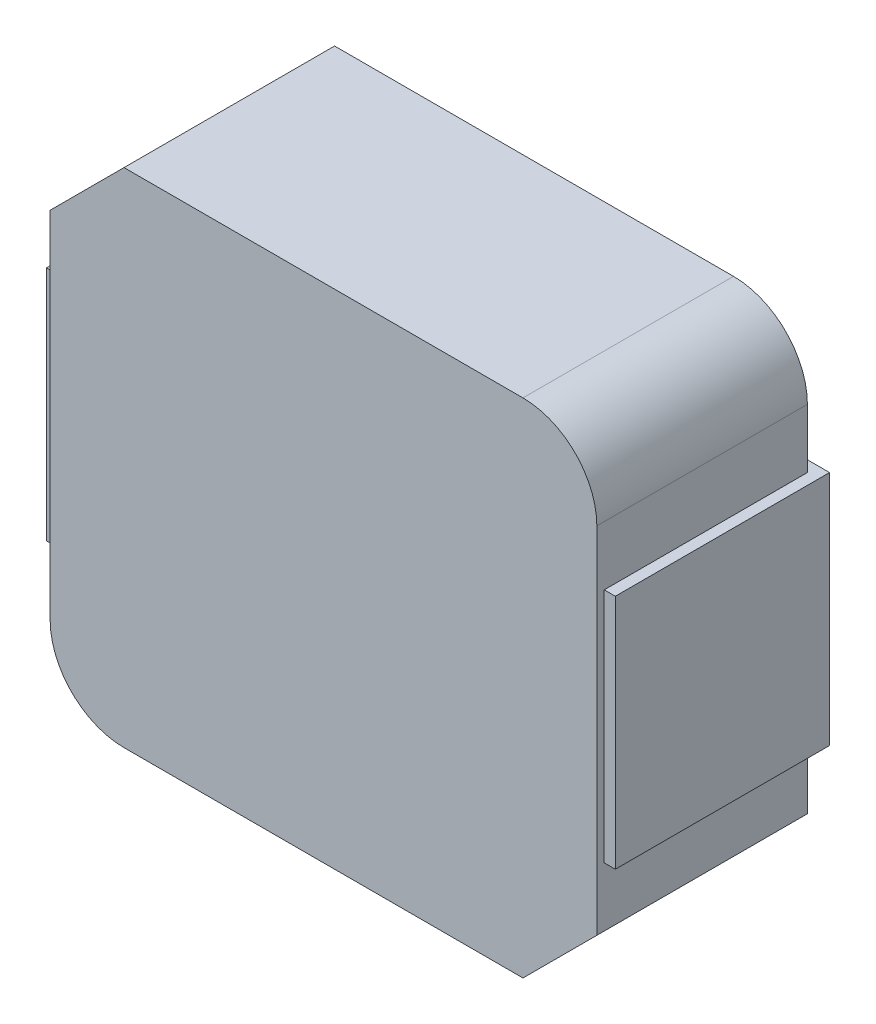
ISO-10303-21;
HEADER;
FILE_DESCRIPTION(('STEP AP214'),'2;1');
FILE_NAME('part.step','',(''),(''),'','','');
FILE_SCHEMA(('AUTOMOTIVE_DESIGN { 1 0 10303 214 1 1 1 1 }'));
ENDSEC;
DATA;
#1=APPLICATION_CONTEXT('core data for automotive mechanical design processes');
#2=APPLICATION_PROTOCOL_DEFINITION('international standard','automotive_design',2000,#1);
#3=PRODUCT_CONTEXT('',#1,'mechanical');
#4=PRODUCT('Part','Part','',(#3));
#5=PRODUCT_RELATED_PRODUCT_CATEGORY('part','',(#4));
#6=PRODUCT_DEFINITION_FORMATION('','',#4);
#7=PRODUCT_DEFINITION_CONTEXT('part definition',#1,'design');
#8=PRODUCT_DEFINITION('design','',#6,#7);
#9=PRODUCT_DEFINITION_SHAPE('','',#8);
#10=(LENGTH_UNIT() NAMED_UNIT(*) SI_UNIT(.MILLI.,.METRE.));
#11=(NAMED_UNIT(*) PLANE_ANGLE_UNIT() SI_UNIT($,.RADIAN.));
#12=(NAMED_UNIT(*) SI_UNIT($,.STERADIAN.) SOLID_ANGLE_UNIT());
#13=UNCERTAINTY_MEASURE_WITH_UNIT(LENGTH_MEASURE(1.E-05),#10,'distance_accuracy_value','');
#14=(GEOMETRIC_REPRESENTATION_CONTEXT(3) GLOBAL_UNCERTAINTY_ASSIGNED_CONTEXT((#13)) GLOBAL_UNIT_ASSIGNED_CONTEXT((#10,
#11,#12)) REPRESENTATION_CONTEXT('',''));
#15=CARTESIAN_POINT('',(0.,0.,0.));
#16=DIRECTION('',(0.,0.,1.));
#17=DIRECTION('',(1.,0.,0.));
#18=AXIS2_PLACEMENT_3D('',#15,#16,#17);
#19=CARTESIAN_POINT('',(3.7,3.4,3.));
#20=DIRECTION('',(-1.,0.,0.));
#21=DIRECTION('',(0.,0.,1.));
#22=AXIS2_PLACEMENT_3D('',#19,#20,#21);
#23=PLANE('',#22);
#24=DIRECTION('',(0.,-1.,0.));
#25=VECTOR('',#24,1.);
#26=CARTESIAN_POINT('',(3.7,1.6,2.9));
#27=LINE('',#26,#25);
#28=CARTESIAN_POINT('',(3.7,1.6,2.9));
#29=VERTEX_POINT('',#28);
#30=CARTESIAN_POINT('',(3.7,-1.6,2.9));
#31=VERTEX_POINT('',#30);
#32=EDGE_CURVE('E265',#29,#31,#27,.T.);
#33=ORIENTED_EDGE('',*,*,#32,.F.);
#34=DIRECTION('',(0.,0.,1.));
#35=VECTOR('',#34,1.);
#36=CARTESIAN_POINT('',(3.7,1.6,0.15));
#37=LINE('',#36,#35);
#38=CARTESIAN_POINT('',(3.7,1.6,0.15));
#39=VERTEX_POINT('',#38);
#40=EDGE_CURVE('E236',#39,#29,#37,.T.);
#41=ORIENTED_EDGE('',*,*,#40,.F.);
#42=DIRECTION('',(0.,1.,0.));
#43=VECTOR('',#42,1.);
#44=CARTESIAN_POINT('',(3.7,3.4,0.15));
#45=LINE('',#44,#43);
#46=CARTESIAN_POINT('',(3.7,2.4,0.15));
#47=VERTEX_POINT('',#46);
#48=EDGE_CURVE('E270',#39,#47,#45,.T.);
#49=ORIENTED_EDGE('',*,*,#48,.T.);
#50=DIRECTION('',(0.,0.,-1.));
#51=VECTOR('',#50,1.);
#52=CARTESIAN_POINT('',(3.7,2.4,3.));
#53=LINE('',#52,#51);
#54=CARTESIAN_POINT('',(3.7,2.4,3.));
#55=VERTEX_POINT('',#54);
#56=EDGE_CURVE('E312',#47,#55,#53,.F.);
#57=ORIENTED_EDGE('',*,*,#56,.T.);
#58=DIRECTION('',(0.,1.,0.));
#59=VECTOR('',#58,1.);
#60=CARTESIAN_POINT('',(3.7,3.4,3.));
#61=LINE('',#60,#59);
#62=CARTESIAN_POINT('',(3.7,-2.4,3.));
#63=VERTEX_POINT('',#62);
#64=EDGE_CURVE('E271',#63,#55,#61,.T.);
#65=ORIENTED_EDGE('',*,*,#64,.F.);
#66=DIRECTION('',(0.,0.,-1.));
#67=VECTOR('',#66,1.);
#68=CARTESIAN_POINT('',(3.7,-2.4,3.));
#69=LINE('',#68,#67);
#70=CARTESIAN_POINT('',(3.7,-2.4,0.15));
#71=VERTEX_POINT('',#70);
#72=EDGE_CURVE('E315',#63,#71,#69,.T.);
#73=ORIENTED_EDGE('',*,*,#72,.T.);
#74=CARTESIAN_POINT('',(3.7,-1.6,0.15));
#75=VERTEX_POINT('',#74);
#76=EDGE_CURVE('E283',#71,#75,#45,.T.);
#77=ORIENTED_EDGE('',*,*,#76,.T.);
#78=DIRECTION('',(0.,0.,1.));
#79=VECTOR('',#78,1.);
#80=CARTESIAN_POINT('',(3.7,-1.6,0.15));
#81=LINE('',#80,#79);
#82=EDGE_CURVE('E250',#75,#31,#81,.T.);
#83=ORIENTED_EDGE('',*,*,#82,.T.);
#84=EDGE_LOOP('',(#33,#41,#49,#57,#65,#73,#77,#83));
#85=FACE_BOUND('',#84,.T.);
#86=ADVANCED_FACE('F39',(#85),#23,.F.);
#87=CARTESIAN_POINT('',(-3.7,3.4,3.));
#88=DIRECTION('',(0.,-1.,0.));
#89=DIRECTION('',(1.,0.,0.));
#90=AXIS2_PLACEMENT_3D('',#87,#88,#89);
#91=PLANE('',#90);
#92=DIRECTION('',(-1.,0.,0.));
#93=VECTOR('',#92,1.);
#94=CARTESIAN_POINT('',(-3.7,3.4,0.15));
#95=LINE('',#94,#93);
#96=CARTESIAN_POINT('',(2.7,3.4,0.15));
#97=VERTEX_POINT('',#96);
#98=CARTESIAN_POINT('',(-2.7,3.4,0.15));
#99=VERTEX_POINT('',#98);
#100=EDGE_CURVE('E286',#97,#99,#95,.T.);
#101=ORIENTED_EDGE('',*,*,#100,.T.);
#102=DIRECTION('',(0.,0.,1.));
#103=VECTOR('',#102,1.);
#104=CARTESIAN_POINT('',(-2.7,3.4,3.));
#105=LINE('',#104,#103);
#106=CARTESIAN_POINT('',(-2.7,3.4,3.));
#107=VERTEX_POINT('',#106);
#108=EDGE_CURVE('E11',#99,#107,#105,.T.);
#109=ORIENTED_EDGE('',*,*,#108,.T.);
#110=DIRECTION('',(-1.,0.,0.));
#111=VECTOR('',#110,1.);
#112=CARTESIAN_POINT('',(-3.7,3.4,3.));
#113=LINE('',#112,#111);
#114=CARTESIAN_POINT('',(2.7,3.4,3.));
#115=VERTEX_POINT('',#114);
#116=EDGE_CURVE('E273',#115,#107,#113,.T.);
#117=ORIENTED_EDGE('',*,*,#116,.F.);
#118=DIRECTION('',(0.,0.,-1.));
#119=VECTOR('',#118,1.);
#120=CARTESIAN_POINT('',(2.7,3.4,3.));
#121=LINE('',#120,#119);
#122=EDGE_CURVE('E309',#115,#97,#121,.T.);
#123=ORIENTED_EDGE('',*,*,#122,.T.);
#124=EDGE_LOOP('',(#101,#109,#117,#123));
#125=FACE_BOUND('',#124,.T.);
#126=ADVANCED_FACE('F372',(#125),#91,.F.);
#127=CARTESIAN_POINT('',(-3.7,3.4,3.));
#128=DIRECTION('',(1.,0.,0.));
#129=DIRECTION('',(0.,1.,0.));
#130=AXIS2_PLACEMENT_3D('',#127,#128,#129);
#131=PLANE('',#130);
#132=DIRECTION('',(0.,-1.,0.));
#133=VECTOR('',#132,1.);
#134=CARTESIAN_POINT('',(-3.7,3.4,0.15));
#135=LINE('',#134,#133);
#136=CARTESIAN_POINT('',(-3.7,2.4,0.15));
#137=VERTEX_POINT('',#136);
#138=CARTESIAN_POINT('',(-3.7,1.6,0.15));
#139=VERTEX_POINT('',#138);
#140=EDGE_CURVE('E290',#137,#139,#135,.T.);
#141=ORIENTED_EDGE('',*,*,#140,.T.);
#142=DIRECTION('',(0.,0.,1.));
#143=VECTOR('',#142,1.);
#144=CARTESIAN_POINT('',(-3.7,1.6,0.15));
#145=LINE('',#144,#143);
#146=CARTESIAN_POINT('',(-3.7,1.6,2.9));
#147=VERTEX_POINT('',#146);
#148=EDGE_CURVE('E54',#139,#147,#145,.T.);
#149=ORIENTED_EDGE('',*,*,#148,.T.);
#150=DIRECTION('',(0.,-1.,0.));
#151=VECTOR('',#150,1.);
#152=CARTESIAN_POINT('',(-3.7,1.6,2.9));
#153=LINE('',#152,#151);
#154=CARTESIAN_POINT('',(-3.7,-1.6,2.9));
#155=VERTEX_POINT('',#154);
#156=EDGE_CURVE('E58',#147,#155,#153,.T.);
#157=ORIENTED_EDGE('',*,*,#156,.T.);
#158=DIRECTION('',(0.,0.,1.));
#159=VECTOR('',#158,1.);
#160=CARTESIAN_POINT('',(-3.7,-1.6,0.15));
#161=LINE('',#160,#159);
#162=CARTESIAN_POINT('',(-3.7,-1.6,0.15));
#163=VERTEX_POINT('',#162);
#164=EDGE_CURVE('E219',#163,#155,#161,.T.);
#165=ORIENTED_EDGE('',*,*,#164,.F.);
#166=CARTESIAN_POINT('',(-3.7,-2.4,0.15));
#167=VERTEX_POINT('',#166);
#168=EDGE_CURVE('E289',#163,#167,#135,.T.);
#169=ORIENTED_EDGE('',*,*,#168,.T.);
#170=DIRECTION('',(0.,0.,-1.));
#171=VECTOR('',#170,1.);
#172=CARTESIAN_POINT('',(-3.7,-2.4,3.));
#173=LINE('',#172,#171);
#174=CARTESIAN_POINT('',(-3.7,-2.4,3.));
#175=VERTEX_POINT('',#174);
#176=EDGE_CURVE('E302',#167,#175,#173,.F.);
#177=ORIENTED_EDGE('',*,*,#176,.T.);
#178=DIRECTION('',(0.,-1.,0.));
#179=VECTOR('',#178,1.);
#180=CARTESIAN_POINT('',(-3.7,3.4,3.));
#181=LINE('',#180,#179);
#182=CARTESIAN_POINT('',(-3.7,2.4,3.));
#183=VERTEX_POINT('',#182);
#184=EDGE_CURVE('E277',#183,#175,#181,.T.);
#185=ORIENTED_EDGE('',*,*,#184,.F.);
#186=DIRECTION('',(0.,0.,-1.));
#187=VECTOR('',#186,1.);
#188=CARTESIAN_POINT('',(-3.7,2.4,3.));
#189=LINE('',#188,#187);
#190=EDGE_CURVE('E47',#183,#137,#189,.T.);
#191=ORIENTED_EDGE('',*,*,#190,.T.);
#192=EDGE_LOOP('',(#141,#149,#157,#165,#169,#177,#185,#191));
#193=FACE_BOUND('',#192,.T.);
#194=ADVANCED_FACE('F331',(#193),#131,.F.);
#195=CARTESIAN_POINT('',(-3.7,-3.4,3.));
#196=DIRECTION('',(0.,1.,0.));
#197=DIRECTION('',(-1.,0.,0.));
#198=AXIS2_PLACEMENT_3D('',#195,#196,#197);
#199=PLANE('',#198);
#200=DIRECTION('',(1.,0.,0.));
#201=VECTOR('',#200,1.);
#202=CARTESIAN_POINT('',(-3.7,-3.4,0.15));
#203=LINE('',#202,#201);
#204=CARTESIAN_POINT('',(-2.7,-3.4,0.15));
#205=VERTEX_POINT('',#204);
#206=CARTESIAN_POINT('',(2.7,-3.4,0.15));
#207=VERTEX_POINT('',#206);
#208=EDGE_CURVE('E274',#205,#207,#203,.T.);
#209=ORIENTED_EDGE('',*,*,#208,.T.);
#210=DIRECTION('',(0.,0.,1.));
#211=VECTOR('',#210,1.);
#212=CARTESIAN_POINT('',(2.7,-3.4,3.));
#213=LINE('',#212,#211);
#214=CARTESIAN_POINT('',(2.7,-3.4,3.));
#215=VERTEX_POINT('',#214);
#216=EDGE_CURVE('E322',#207,#215,#213,.T.);
#217=ORIENTED_EDGE('',*,*,#216,.T.);
#218=DIRECTION('',(1.,0.,0.));
#219=VECTOR('',#218,1.);
#220=CARTESIAN_POINT('',(-3.7,-3.4,3.));
#221=LINE('',#220,#219);
#222=CARTESIAN_POINT('',(-2.7,-3.4,3.));
#223=VERTEX_POINT('',#222);
#224=EDGE_CURVE('E279',#223,#215,#221,.T.);
#225=ORIENTED_EDGE('',*,*,#224,.F.);
#226=DIRECTION('',(0.,0.,-1.));
#227=VECTOR('',#226,1.);
#228=CARTESIAN_POINT('',(-2.7,-3.4,3.));
#229=LINE('',#228,#227);
#230=EDGE_CURVE('E282',#223,#205,#229,.T.);
#231=ORIENTED_EDGE('',*,*,#230,.T.);
#232=EDGE_LOOP('',(#209,#217,#225,#231));
#233=FACE_BOUND('',#232,.T.);
#234=ADVANCED_FACE('F356',(#233),#199,.F.);
#235=CARTESIAN_POINT('',(0.,0.,3.));
#236=DIRECTION('',(0.,0.,1.));
#237=DIRECTION('',(1.,0.,0.));
#238=AXIS2_PLACEMENT_3D('',#235,#236,#237);
#239=PLANE('',#238);
#240=ORIENTED_EDGE('',*,*,#224,.T.);
#241=DIRECTION('',(-0.707106781186549,-0.707106781186546,0.));
#242=VECTOR('',#241,1.);
#243=CARTESIAN_POINT('',(3.04999999999999,-3.05,3.));
#244=LINE('',#243,#242);
#245=EDGE_CURVE('E326',#215,#63,#244,.F.);
#246=ORIENTED_EDGE('',*,*,#245,.T.);
#247=ORIENTED_EDGE('',*,*,#64,.T.);
#248=CARTESIAN_POINT('',(2.7,2.4,3.));
#249=DIRECTION('',(0.,0.,1.));
#250=DIRECTION('',(1.,0.,0.));
#251=AXIS2_PLACEMENT_3D('',#248,#249,#250);
#252=CIRCLE('',#251,1.);
#253=EDGE_CURVE('E305',#55,#115,#252,.T.);
#254=ORIENTED_EDGE('',*,*,#253,.T.);
#255=ORIENTED_EDGE('',*,*,#116,.T.);
#256=DIRECTION('',(0.707106781186548,0.707106781186547,0.));
#257=VECTOR('',#256,1.);
#258=CARTESIAN_POINT('',(-3.05,3.05,3.));
#259=LINE('',#258,#257);
#260=EDGE_CURVE('E324',#107,#183,#259,.F.);
#261=ORIENTED_EDGE('',*,*,#260,.T.);
#262=ORIENTED_EDGE('',*,*,#184,.T.);
#263=CARTESIAN_POINT('',(-2.7,-2.4,3.));
#264=DIRECTION('',(0.,0.,1.));
#265=DIRECTION('',(1.,0.,0.));
#266=AXIS2_PLACEMENT_3D('',#263,#264,#265);
#267=CIRCLE('',#266,1.);
#268=EDGE_CURVE('E307',#175,#223,#267,.T.);
#269=ORIENTED_EDGE('',*,*,#268,.T.);
#270=EDGE_LOOP('',(#240,#246,#247,#254,#255,#261,#262,#269));
#271=FACE_BOUND('',#270,.T.);
#272=ADVANCED_FACE('F353',(#271),#239,.T.);
#273=CARTESIAN_POINT('',(0.,0.,0.15));
#274=DIRECTION('',(0.,0.,1.));
#275=DIRECTION('',(1.,0.,0.));
#276=AXIS2_PLACEMENT_3D('',#273,#274,#275);
#277=PLANE('',#276);
#278=DIRECTION('',(0.,-1.,0.));
#279=VECTOR('',#278,1.);
#280=CARTESIAN_POINT('',(-2.,1.6,0.15));
#281=LINE('',#280,#279);
#282=CARTESIAN_POINT('',(-2.,1.6,0.15));
#283=VERTEX_POINT('',#282);
#284=CARTESIAN_POINT('',(-2.,-1.6,0.15));
#285=VERTEX_POINT('',#284);
#286=EDGE_CURVE('E209',#283,#285,#281,.T.);
#287=ORIENTED_EDGE('',*,*,#286,.F.);
#288=DIRECTION('',(-1.,0.,0.));
#289=VECTOR('',#288,1.);
#290=CARTESIAN_POINT('',(-2.,1.6,0.15));
#291=LINE('',#290,#289);
#292=EDGE_CURVE('E196',#283,#139,#291,.T.);
#293=ORIENTED_EDGE('',*,*,#292,.T.);
#294=ORIENTED_EDGE('',*,*,#140,.F.);
#295=DIRECTION('',(-0.707106781186548,-0.707106781186547,0.));
#296=VECTOR('',#295,1.);
#297=CARTESIAN_POINT('',(-3.7,2.4,0.15));
#298=LINE('',#297,#296);
#299=EDGE_CURVE('E318',#137,#99,#298,.F.);
#300=ORIENTED_EDGE('',*,*,#299,.T.);
#301=ORIENTED_EDGE('',*,*,#100,.F.);
#302=CARTESIAN_POINT('',(2.7,2.4,0.15));
#303=DIRECTION('',(0.,0.,1.));
#304=DIRECTION('',(1.,0.,0.));
#305=AXIS2_PLACEMENT_3D('',#302,#303,#304);
#306=CIRCLE('',#305,1.);
#307=EDGE_CURVE('E296',#97,#47,#306,.F.);
#308=ORIENTED_EDGE('',*,*,#307,.T.);
#309=ORIENTED_EDGE('',*,*,#48,.F.);
#310=DIRECTION('',(1.,0.,0.));
#311=VECTOR('',#310,1.);
#312=CARTESIAN_POINT('',(2.,1.6,0.15));
#313=LINE('',#312,#311);
#314=CARTESIAN_POINT('',(2.,1.6,0.15));
#315=VERTEX_POINT('',#314);
#316=EDGE_CURVE('E232',#315,#39,#313,.T.);
#317=ORIENTED_EDGE('',*,*,#316,.F.);
#318=DIRECTION('',(0.,-1.,0.));
#319=VECTOR('',#318,1.);
#320=CARTESIAN_POINT('',(2.,1.6,0.15));
#321=LINE('',#320,#319);
#322=CARTESIAN_POINT('',(2.,-1.6,0.15));
#323=VERTEX_POINT('',#322);
#324=EDGE_CURVE('E268',#315,#323,#321,.T.);
#325=ORIENTED_EDGE('',*,*,#324,.T.);
#326=DIRECTION('',(1.,0.,0.));
#327=VECTOR('',#326,1.);
#328=CARTESIAN_POINT('',(2.,-1.6,0.15));
#329=LINE('',#328,#327);
#330=EDGE_CURVE('E248',#323,#75,#329,.T.);
#331=ORIENTED_EDGE('',*,*,#330,.T.);
#332=ORIENTED_EDGE('',*,*,#76,.F.);
#333=DIRECTION('',(0.707106781186549,0.707106781186546,0.));
#334=VECTOR('',#333,1.);
#335=CARTESIAN_POINT('',(3.7,-2.4,0.15));
#336=LINE('',#335,#334);
#337=EDGE_CURVE('E320',#71,#207,#336,.F.);
#338=ORIENTED_EDGE('',*,*,#337,.T.);
#339=ORIENTED_EDGE('',*,*,#208,.F.);
#340=CARTESIAN_POINT('',(-2.7,-2.4,0.15));
#341=DIRECTION('',(0.,0.,1.));
#342=DIRECTION('',(1.,0.,0.));
#343=AXIS2_PLACEMENT_3D('',#340,#341,#342);
#344=CIRCLE('',#343,1.);
#345=EDGE_CURVE('E299',#205,#167,#344,.F.);
#346=ORIENTED_EDGE('',*,*,#345,.T.);
#347=ORIENTED_EDGE('',*,*,#168,.F.);
#348=DIRECTION('',(-1.,0.,0.));
#349=VECTOR('',#348,1.);
#350=CARTESIAN_POINT('',(-2.,-1.6,0.15));
#351=LINE('',#350,#349);
#352=EDGE_CURVE('E197',#285,#163,#351,.T.);
#353=ORIENTED_EDGE('',*,*,#352,.F.);
#354=EDGE_LOOP('',(#287,#293,#294,#300,#301,#308,#309,#317,#325,#331,#332,#338,#339,#346,#347,#353));
#355=FACE_BOUND('',#354,.T.);
#356=ADVANCED_FACE('F335',(#355),#277,.F.);
#357=CARTESIAN_POINT('',(-2.7,-2.4,3.));
#358=DIRECTION('',(0.,0.,-1.));
#359=DIRECTION('',(-1.,0.,0.));
#360=AXIS2_PLACEMENT_3D('',#357,#358,#359);
#361=CYLINDRICAL_SURFACE('',#360,1.);
#362=ORIENTED_EDGE('',*,*,#268,.F.);
#363=ORIENTED_EDGE('',*,*,#176,.F.);
#364=ORIENTED_EDGE('',*,*,#345,.F.);
#365=ORIENTED_EDGE('',*,*,#230,.F.);
#366=EDGE_LOOP('',(#362,#363,#364,#365));
#367=FACE_BOUND('',#366,.T.);
#368=ADVANCED_FACE('F350',(#367),#361,.T.);
#369=CARTESIAN_POINT('',(2.7,2.4,3.));
#370=DIRECTION('',(0.,0.,-1.));
#371=DIRECTION('',(-1.,0.,0.));
#372=AXIS2_PLACEMENT_3D('',#369,#370,#371);
#373=CYLINDRICAL_SURFACE('',#372,1.);
#374=ORIENTED_EDGE('',*,*,#253,.F.);
#375=ORIENTED_EDGE('',*,*,#56,.F.);
#376=ORIENTED_EDGE('',*,*,#307,.F.);
#377=ORIENTED_EDGE('',*,*,#122,.F.);
#378=EDGE_LOOP('',(#374,#375,#376,#377));
#379=FACE_BOUND('',#378,.T.);
#380=ADVANCED_FACE('F369',(#379),#373,.T.);
#381=CARTESIAN_POINT('',(3.7,-2.4,3.));
#382=DIRECTION('',(-0.707106781186546,0.707106781186549,0.));
#383=DIRECTION('',(0.,0.,-1.));
#384=AXIS2_PLACEMENT_3D('',#381,#382,#383);
#385=PLANE('',#384);
#386=ORIENTED_EDGE('',*,*,#245,.F.);
#387=ORIENTED_EDGE('',*,*,#216,.F.);
#388=ORIENTED_EDGE('',*,*,#337,.F.);
#389=ORIENTED_EDGE('',*,*,#72,.F.);
#390=EDGE_LOOP('',(#386,#387,#388,#389));
#391=FACE_BOUND('',#390,.T.);
#392=ADVANCED_FACE('F359',(#391),#385,.F.);
#393=CARTESIAN_POINT('',(-3.7,2.4,3.));
#394=DIRECTION('',(0.707106781186547,-0.707106781186548,0.));
#395=DIRECTION('',(0.,0.,-1.));
#396=AXIS2_PLACEMENT_3D('',#393,#394,#395);
#397=PLANE('',#396);
#398=ORIENTED_EDGE('',*,*,#260,.F.);
#399=ORIENTED_EDGE('',*,*,#108,.F.);
#400=ORIENTED_EDGE('',*,*,#299,.F.);
#401=ORIENTED_EDGE('',*,*,#190,.F.);
#402=EDGE_LOOP('',(#398,#399,#400,#401));
#403=FACE_BOUND('',#402,.T.);
#404=ADVANCED_FACE('F41',(#403),#397,.F.);
#405=CARTESIAN_POINT('',(2.,1.6,0.));
#406=DIRECTION('',(1.,0.,0.));
#407=DIRECTION('',(0.,0.,-1.));
#408=AXIS2_PLACEMENT_3D('',#405,#406,#407);
#409=PLANE('',#408);
#410=DIRECTION('',(0.,0.,1.));
#411=VECTOR('',#410,1.);
#412=CARTESIAN_POINT('',(2.,-1.6,0.));
#413=LINE('',#412,#411);
#414=CARTESIAN_POINT('',(2.,-1.6,0.));
#415=VERTEX_POINT('',#414);
#416=EDGE_CURVE('E187',#415,#323,#413,.T.);
#417=ORIENTED_EDGE('',*,*,#416,.T.);
#418=ORIENTED_EDGE('',*,*,#324,.F.);
#419=DIRECTION('',(0.,0.,1.));
#420=VECTOR('',#419,1.);
#421=CARTESIAN_POINT('',(2.,1.6,0.));
#422=LINE('',#421,#420);
#423=CARTESIAN_POINT('',(2.,1.6,0.));
#424=VERTEX_POINT('',#423);
#425=EDGE_CURVE('E229',#424,#315,#422,.T.);
#426=ORIENTED_EDGE('',*,*,#425,.F.);
#427=DIRECTION('',(0.,-1.,0.));
#428=VECTOR('',#427,1.);
#429=CARTESIAN_POINT('',(2.,1.6,0.));
#430=LINE('',#429,#428);
#431=EDGE_CURVE('E245',#424,#415,#430,.T.);
#432=ORIENTED_EDGE('',*,*,#431,.T.);
#433=EDGE_LOOP('',(#417,#418,#426,#432));
#434=FACE_BOUND('',#433,.T.);
#435=ADVANCED_FACE('F375',(#434),#409,.F.);
#436=CARTESIAN_POINT('',(3.7,1.6,2.9));
#437=DIRECTION('',(0.,0.,-1.));
#438=DIRECTION('',(-1.,0.,0.));
#439=AXIS2_PLACEMENT_3D('',#436,#437,#438);
#440=PLANE('',#439);
#441=DIRECTION('',(1.,0.,0.));
#442=VECTOR('',#441,1.);
#443=CARTESIAN_POINT('',(3.7,-1.6,2.9));
#444=LINE('',#443,#442);
#445=CARTESIAN_POINT('',(3.85,-1.6,2.9));
#446=VERTEX_POINT('',#445);
#447=EDGE_CURVE('E252',#31,#446,#444,.T.);
#448=ORIENTED_EDGE('',*,*,#447,.T.);
#449=DIRECTION('',(0.,-1.,0.));
#450=VECTOR('',#449,1.);
#451=CARTESIAN_POINT('',(3.85,1.6,2.9));
#452=LINE('',#451,#450);
#453=CARTESIAN_POINT('',(3.85,1.6,2.9));
#454=VERTEX_POINT('',#453);
#455=EDGE_CURVE('E262',#454,#446,#452,.T.);
#456=ORIENTED_EDGE('',*,*,#455,.F.);
#457=DIRECTION('',(1.,0.,0.));
#458=VECTOR('',#457,1.);
#459=CARTESIAN_POINT('',(3.7,1.6,2.9));
#460=LINE('',#459,#458);
#461=EDGE_CURVE('E239',#29,#454,#460,.T.);
#462=ORIENTED_EDGE('',*,*,#461,.F.);
#463=ORIENTED_EDGE('',*,*,#32,.T.);
#464=EDGE_LOOP('',(#448,#456,#462,#463));
#465=FACE_BOUND('',#464,.T.);
#466=ADVANCED_FACE('F380',(#465),#440,.F.);
#467=CARTESIAN_POINT('',(3.85,1.6,2.9));
#468=DIRECTION('',(-1.,0.,0.));
#469=DIRECTION('',(0.,0.,1.));
#470=AXIS2_PLACEMENT_3D('',#467,#468,#469);
#471=PLANE('',#470);
#472=DIRECTION('',(0.,0.,-1.));
#473=VECTOR('',#472,1.);
#474=CARTESIAN_POINT('',(3.85,-1.6,2.9));
#475=LINE('',#474,#473);
#476=CARTESIAN_POINT('',(3.85,-1.6,0.));
#477=VERTEX_POINT('',#476);
#478=EDGE_CURVE('E254',#446,#477,#475,.T.);
#479=ORIENTED_EDGE('',*,*,#478,.T.);
#480=DIRECTION('',(0.,-1.,0.));
#481=VECTOR('',#480,1.);
#482=CARTESIAN_POINT('',(3.85,1.6,0.));
#483=LINE('',#482,#481);
#484=CARTESIAN_POINT('',(3.85,1.6,0.));
#485=VERTEX_POINT('',#484);
#486=EDGE_CURVE('E259',#485,#477,#483,.T.);
#487=ORIENTED_EDGE('',*,*,#486,.F.);
#488=DIRECTION('',(0.,0.,-1.));
#489=VECTOR('',#488,1.);
#490=CARTESIAN_POINT('',(3.85,1.6,2.9));
#491=LINE('',#490,#489);
#492=EDGE_CURVE('E241',#454,#485,#491,.T.);
#493=ORIENTED_EDGE('',*,*,#492,.F.);
#494=ORIENTED_EDGE('',*,*,#455,.T.);
#495=EDGE_LOOP('',(#479,#487,#493,#494));
#496=FACE_BOUND('',#495,.T.);
#497=ADVANCED_FACE('F433',(#496),#471,.F.);
#498=CARTESIAN_POINT('',(3.85,1.6,0.));
#499=DIRECTION('',(0.,0.,1.));
#500=DIRECTION('',(1.,0.,0.));
#501=AXIS2_PLACEMENT_3D('',#498,#499,#500);
#502=PLANE('',#501);
#503=DIRECTION('',(-1.,0.,0.));
#504=VECTOR('',#503,1.);
#505=CARTESIAN_POINT('',(3.85,-1.6,0.));
#506=LINE('',#505,#504);
#507=EDGE_CURVE('E233',#477,#415,#506,.T.);
#508=ORIENTED_EDGE('',*,*,#507,.T.);
#509=ORIENTED_EDGE('',*,*,#431,.F.);
#510=DIRECTION('',(-1.,0.,0.));
#511=VECTOR('',#510,1.);
#512=CARTESIAN_POINT('',(3.85,1.6,0.));
#513=LINE('',#512,#511);
#514=EDGE_CURVE('E243',#485,#424,#513,.T.);
#515=ORIENTED_EDGE('',*,*,#514,.F.);
#516=ORIENTED_EDGE('',*,*,#486,.T.);
#517=EDGE_LOOP('',(#508,#509,#515,#516));
#518=FACE_BOUND('',#517,.T.);
#519=ADVANCED_FACE('F443',(#518),#502,.F.);
#520=CARTESIAN_POINT('',(0.,1.6,0.));
#521=DIRECTION('',(0.,1.,0.));
#522=DIRECTION('',(0.,0.,1.));
#523=AXIS2_PLACEMENT_3D('',#520,#521,#522);
#524=PLANE('',#523);
#525=ORIENTED_EDGE('',*,*,#425,.T.);
#526=ORIENTED_EDGE('',*,*,#316,.T.);
#527=ORIENTED_EDGE('',*,*,#40,.T.);
#528=ORIENTED_EDGE('',*,*,#461,.T.);
#529=ORIENTED_EDGE('',*,*,#492,.T.);
#530=ORIENTED_EDGE('',*,*,#514,.T.);
#531=EDGE_LOOP('',(#525,#526,#527,#528,#529,#530));
#532=FACE_BOUND('',#531,.T.);
#533=ADVANCED_FACE('F453',(#532),#524,.T.);
#534=CARTESIAN_POINT('',(0.,-1.6,0.));
#535=DIRECTION('',(0.,1.,0.));
#536=DIRECTION('',(0.,0.,1.));
#537=AXIS2_PLACEMENT_3D('',#534,#535,#536);
#538=PLANE('',#537);
#539=ORIENTED_EDGE('',*,*,#416,.F.);
#540=ORIENTED_EDGE('',*,*,#507,.F.);
#541=ORIENTED_EDGE('',*,*,#478,.F.);
#542=ORIENTED_EDGE('',*,*,#447,.F.);
#543=ORIENTED_EDGE('',*,*,#82,.F.);
#544=ORIENTED_EDGE('',*,*,#330,.F.);
#545=EDGE_LOOP('',(#539,#540,#541,#542,#543,#544));
#546=FACE_BOUND('',#545,.T.);
#547=ADVANCED_FACE('F463',(#546),#538,.F.);
#548=CARTESIAN_POINT('',(-2.,1.6,0.));
#549=DIRECTION('',(1.,0.,0.));
#550=DIRECTION('',(0.,0.,-1.));
#551=AXIS2_PLACEMENT_3D('',#548,#549,#550);
#552=PLANE('',#551);
#553=DIRECTION('',(0.,0.,1.));
#554=VECTOR('',#553,1.);
#555=CARTESIAN_POINT('',(-2.,-1.6,0.));
#556=LINE('',#555,#554);
#557=CARTESIAN_POINT('',(-2.,-1.6,0.));
#558=VERTEX_POINT('',#557);
#559=EDGE_CURVE('E182',#558,#285,#556,.T.);
#560=ORIENTED_EDGE('',*,*,#559,.F.);
#561=DIRECTION('',(0.,-1.,0.));
#562=VECTOR('',#561,1.);
#563=CARTESIAN_POINT('',(-2.,1.6,0.));
#564=LINE('',#563,#562);
#565=CARTESIAN_POINT('',(-2.,1.6,0.));
#566=VERTEX_POINT('',#565);
#567=EDGE_CURVE('E175',#566,#558,#564,.T.);
#568=ORIENTED_EDGE('',*,*,#567,.F.);
#569=DIRECTION('',(0.,0.,1.));
#570=VECTOR('',#569,1.);
#571=CARTESIAN_POINT('',(-2.,1.6,0.));
#572=LINE('',#571,#570);
#573=EDGE_CURVE('E179',#566,#283,#572,.T.);
#574=ORIENTED_EDGE('',*,*,#573,.T.);
#575=ORIENTED_EDGE('',*,*,#286,.T.);
#576=EDGE_LOOP('',(#560,#568,#574,#575));
#577=FACE_BOUND('',#576,.T.);
#578=ADVANCED_FACE('F177',(#577),#552,.T.);
#579=CARTESIAN_POINT('',(-3.85,1.6,0.));
#580=DIRECTION('',(0.,0.,-1.));
#581=DIRECTION('',(-1.,0.,0.));
#582=AXIS2_PLACEMENT_3D('',#579,#580,#581);
#583=PLANE('',#582);
#584=DIRECTION('',(1.,0.,0.));
#585=VECTOR('',#584,1.);
#586=CARTESIAN_POINT('',(-3.85,-1.6,0.));
#587=LINE('',#586,#585);
#588=CARTESIAN_POINT('',(-3.85,-1.6,0.));
#589=VERTEX_POINT('',#588);
#590=EDGE_CURVE('E211',#589,#558,#587,.T.);
#591=ORIENTED_EDGE('',*,*,#590,.F.);
#592=DIRECTION('',(0.,-1.,0.));
#593=VECTOR('',#592,1.);
#594=CARTESIAN_POINT('',(-3.85,1.6,0.));
#595=LINE('',#594,#593);
#596=CARTESIAN_POINT('',(-3.85,1.6,0.));
#597=VERTEX_POINT('',#596);
#598=EDGE_CURVE('E188',#597,#589,#595,.T.);
#599=ORIENTED_EDGE('',*,*,#598,.F.);
#600=DIRECTION('',(1.,0.,0.));
#601=VECTOR('',#600,1.);
#602=CARTESIAN_POINT('',(-3.85,1.6,0.));
#603=LINE('',#602,#601);
#604=EDGE_CURVE('E194',#597,#566,#603,.T.);
#605=ORIENTED_EDGE('',*,*,#604,.T.);
#606=ORIENTED_EDGE('',*,*,#567,.T.);
#607=EDGE_LOOP('',(#591,#599,#605,#606));
#608=FACE_BOUND('',#607,.T.);
#609=ADVANCED_FACE('F199',(#608),#583,.T.);
#610=CARTESIAN_POINT('',(-3.85,1.6,2.9));
#611=DIRECTION('',(-1.,0.,0.));
#612=DIRECTION('',(0.,0.,1.));
#613=AXIS2_PLACEMENT_3D('',#610,#611,#612);
#614=PLANE('',#613);
#615=DIRECTION('',(0.,0.,-1.));
#616=VECTOR('',#615,1.);
#617=CARTESIAN_POINT('',(-3.85,-1.6,2.9));
#618=LINE('',#617,#616);
#619=CARTESIAN_POINT('',(-3.85,-1.6,2.9));
#620=VERTEX_POINT('',#619);
#621=EDGE_CURVE('E213',#620,#589,#618,.T.);
#622=ORIENTED_EDGE('',*,*,#621,.F.);
#623=DIRECTION('',(0.,-1.,0.));
#624=VECTOR('',#623,1.);
#625=CARTESIAN_POINT('',(-3.85,1.6,2.9));
#626=LINE('',#625,#624);
#627=CARTESIAN_POINT('',(-3.85,1.6,2.9));
#628=VERTEX_POINT('',#627);
#629=EDGE_CURVE('E226',#628,#620,#626,.T.);
#630=ORIENTED_EDGE('',*,*,#629,.F.);
#631=DIRECTION('',(0.,0.,-1.));
#632=VECTOR('',#631,1.);
#633=CARTESIAN_POINT('',(-3.85,1.6,2.9));
#634=LINE('',#633,#632);
#635=EDGE_CURVE('E200',#628,#597,#634,.T.);
#636=ORIENTED_EDGE('',*,*,#635,.T.);
#637=ORIENTED_EDGE('',*,*,#598,.T.);
#638=EDGE_LOOP('',(#622,#630,#636,#637));
#639=FACE_BOUND('',#638,.T.);
#640=ADVANCED_FACE('F341',(#639),#614,.T.);
#641=CARTESIAN_POINT('',(-3.7,1.6,2.9));
#642=DIRECTION('',(0.,0.,1.));
#643=DIRECTION('',(1.,0.,0.));
#644=AXIS2_PLACEMENT_3D('',#641,#642,#643);
#645=PLANE('',#644);
#646=DIRECTION('',(-1.,0.,0.));
#647=VECTOR('',#646,1.);
#648=CARTESIAN_POINT('',(-3.7,-1.6,2.9));
#649=LINE('',#648,#647);
#650=EDGE_CURVE('E216',#155,#620,#649,.T.);
#651=ORIENTED_EDGE('',*,*,#650,.F.);
#652=ORIENTED_EDGE('',*,*,#156,.F.);
#653=DIRECTION('',(-1.,0.,0.));
#654=VECTOR('',#653,1.);
#655=CARTESIAN_POINT('',(-3.7,1.6,2.9));
#656=LINE('',#655,#654);
#657=EDGE_CURVE('E202',#147,#628,#656,.T.);
#658=ORIENTED_EDGE('',*,*,#657,.T.);
#659=ORIENTED_EDGE('',*,*,#629,.T.);
#660=EDGE_LOOP('',(#651,#652,#658,#659));
#661=FACE_BOUND('',#660,.T.);
#662=ADVANCED_FACE('F344',(#661),#645,.T.);
#663=CARTESIAN_POINT('',(0.,1.6,0.));
#664=DIRECTION('',(0.,1.,0.));
#665=DIRECTION('',(0.,0.,1.));
#666=AXIS2_PLACEMENT_3D('',#663,#664,#665);
#667=PLANE('',#666);
#668=ORIENTED_EDGE('',*,*,#573,.F.);
#669=ORIENTED_EDGE('',*,*,#604,.F.);
#670=ORIENTED_EDGE('',*,*,#635,.F.);
#671=ORIENTED_EDGE('',*,*,#657,.F.);
#672=ORIENTED_EDGE('',*,*,#148,.F.);
#673=ORIENTED_EDGE('',*,*,#292,.F.);
#674=EDGE_LOOP('',(#668,#669,#670,#671,#672,#673));
#675=FACE_BOUND('',#674,.T.);
#676=ADVANCED_FACE('F192',(#675),#667,.T.);
#677=CARTESIAN_POINT('',(0.,-1.6,0.));
#678=DIRECTION('',(0.,1.,0.));
#679=DIRECTION('',(0.,0.,1.));
#680=AXIS2_PLACEMENT_3D('',#677,#678,#679);
#681=PLANE('',#680);
#682=ORIENTED_EDGE('',*,*,#559,.T.);
#683=ORIENTED_EDGE('',*,*,#352,.T.);
#684=ORIENTED_EDGE('',*,*,#164,.T.);
#685=ORIENTED_EDGE('',*,*,#650,.T.);
#686=ORIENTED_EDGE('',*,*,#621,.T.);
#687=ORIENTED_EDGE('',*,*,#590,.T.);
#688=EDGE_LOOP('',(#682,#683,#684,#685,#686,#687));
#689=FACE_BOUND('',#688,.T.);
#690=ADVANCED_FACE('F338',(#689),#681,.F.);
#691=CLOSED_SHELL('',(#86,#126,#194,#234,#272,#356,#368,#380,#392,#404,#435,#466,#497,#519,#533,
#547,#578,#609,#640,#662,#676,#690));
#692=MANIFOLD_SOLID_BREP('B2',#691);
#693=ADVANCED_BREP_SHAPE_REPRESENTATION('',(#18,#692),#14);
#694=SHAPE_DEFINITION_REPRESENTATION(#9,#693);
ENDSEC;
END-ISO-10303-21;
